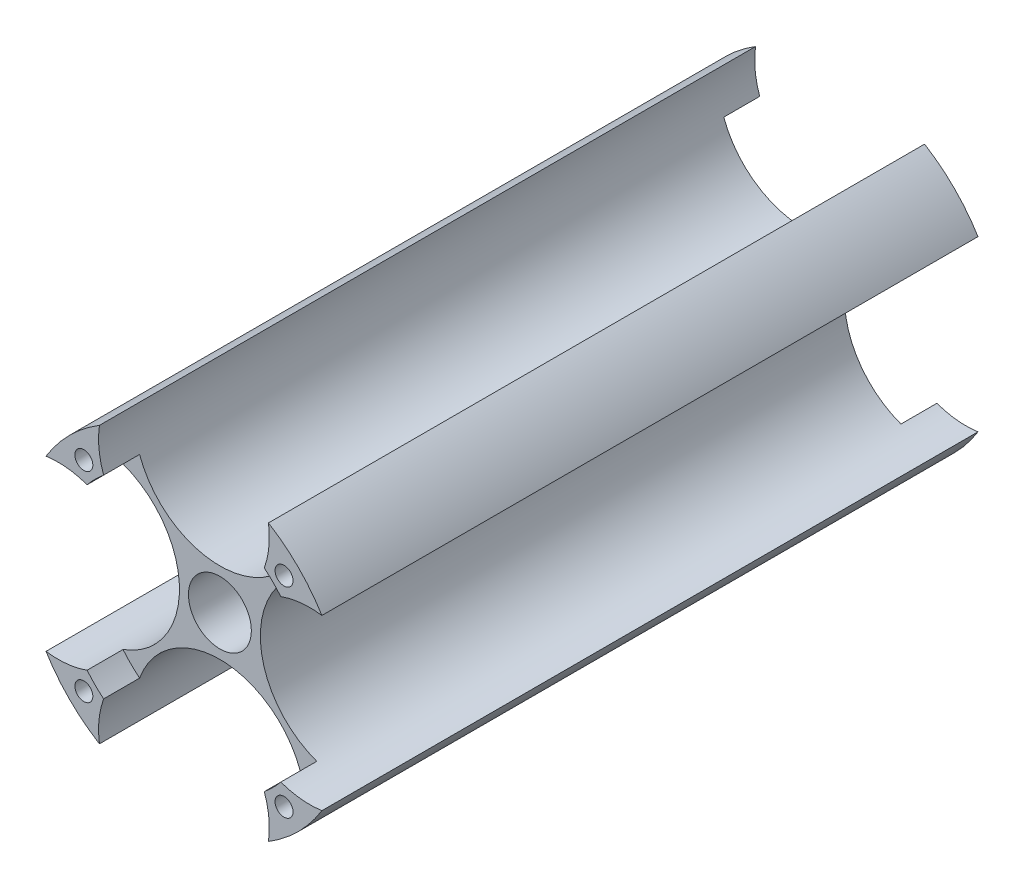
ISO-10303-21;
HEADER;
FILE_DESCRIPTION(('STEP AP214'),'2;1');
FILE_NAME('part.step','',(''),(''),'','','');
FILE_SCHEMA(('AUTOMOTIVE_DESIGN { 1 0 10303 214 1 1 1 1 }'));
ENDSEC;
DATA;
#1=APPLICATION_CONTEXT('core data for automotive mechanical design processes');
#2=APPLICATION_PROTOCOL_DEFINITION('international standard','automotive_design',2000,#1);
#3=PRODUCT_CONTEXT('',#1,'mechanical');
#4=PRODUCT('Part','Part','',(#3));
#5=PRODUCT_RELATED_PRODUCT_CATEGORY('part','',(#4));
#6=PRODUCT_DEFINITION_FORMATION('','',#4);
#7=PRODUCT_DEFINITION_CONTEXT('part definition',#1,'design');
#8=PRODUCT_DEFINITION('design','',#6,#7);
#9=PRODUCT_DEFINITION_SHAPE('','',#8);
#10=(LENGTH_UNIT() NAMED_UNIT(*) SI_UNIT(.MILLI.,.METRE.));
#11=(NAMED_UNIT(*) PLANE_ANGLE_UNIT() SI_UNIT($,.RADIAN.));
#12=(NAMED_UNIT(*) SI_UNIT($,.STERADIAN.) SOLID_ANGLE_UNIT());
#13=UNCERTAINTY_MEASURE_WITH_UNIT(LENGTH_MEASURE(1.E-05),#10,'distance_accuracy_value','');
#14=(GEOMETRIC_REPRESENTATION_CONTEXT(3) GLOBAL_UNCERTAINTY_ASSIGNED_CONTEXT((#13)) GLOBAL_UNIT_ASSIGNED_CONTEXT((#10,
#11,#12)) REPRESENTATION_CONTEXT('',''));
#15=CARTESIAN_POINT('',(0.,0.,0.));
#16=DIRECTION('',(0.,0.,1.));
#17=DIRECTION('',(1.,0.,0.));
#18=AXIS2_PLACEMENT_3D('',#15,#16,#17);
#19=CARTESIAN_POINT('',(0.,0.,0.));
#20=DIRECTION('',(0.,0.,1.));
#21=DIRECTION('',(1.,0.,0.));
#22=AXIS2_PLACEMENT_3D('',#19,#20,#21);
#23=PLANE('',#22);
#24=CARTESIAN_POINT('',(0.,0.,0.));
#25=DIRECTION('',(0.,0.,1.));
#26=DIRECTION('',(1.,0.,0.));
#27=AXIS2_PLACEMENT_3D('',#24,#25,#26);
#28=CIRCLE('',#27,3.5);
#29=CARTESIAN_POINT('',(3.5,0.,0.));
#30=VERTEX_POINT('',#29);
#31=EDGE_CURVE('E385',#30,#30,#28,.T.);
#32=ORIENTED_EDGE('',*,*,#31,.T.);
#33=EDGE_LOOP('',(#32));
#34=FACE_BOUND('',#33,.T.);
#35=CARTESIAN_POINT('',(-14.,0.,0.));
#36=DIRECTION('',(0.,0.,1.));
#37=DIRECTION('',(1.,0.,0.));
#38=AXIS2_PLACEMENT_3D('',#35,#36,#37);
#39=CIRCLE('',#38,9.5);
#40=CARTESIAN_POINT('',(-10.7767857142857,-8.93649202250903,0.));
#41=VERTEX_POINT('',#40);
#42=CARTESIAN_POINT('',(-10.7767857142857,8.93649202250902,0.));
#43=VERTEX_POINT('',#42);
#44=EDGE_CURVE('E57',#41,#43,#39,.T.);
#45=ORIENTED_EDGE('',*,*,#44,.T.);
#46=CARTESIAN_POINT('',(0.,0.,0.));
#47=DIRECTION('',(0.,0.,-1.));
#48=DIRECTION('',(-1.,0.,0.));
#49=AXIS2_PLACEMENT_3D('',#46,#47,#48);
#50=CIRCLE('',#49,14.);
#51=CARTESIAN_POINT('',(-8.93649202250903,10.7767857142857,0.));
#52=VERTEX_POINT('',#51);
#53=EDGE_CURVE('E52',#43,#52,#50,.T.);
#54=ORIENTED_EDGE('',*,*,#53,.T.);
#55=CARTESIAN_POINT('',(0.,14.,0.));
#56=DIRECTION('',(0.,0.,1.));
#57=DIRECTION('',(1.,0.,0.));
#58=AXIS2_PLACEMENT_3D('',#55,#56,#57);
#59=CIRCLE('',#58,9.50000000000001);
#60=CARTESIAN_POINT('',(8.93649202250903,10.7767857142857,0.));
#61=VERTEX_POINT('',#60);
#62=EDGE_CURVE('E398',#52,#61,#59,.T.);
#63=ORIENTED_EDGE('',*,*,#62,.T.);
#64=CARTESIAN_POINT('',(0.,0.,0.));
#65=DIRECTION('',(0.,0.,-1.));
#66=DIRECTION('',(-1.,0.,0.));
#67=AXIS2_PLACEMENT_3D('',#64,#65,#66);
#68=CIRCLE('',#67,14.);
#69=CARTESIAN_POINT('',(10.7767857142857,8.93649202250902,0.));
#70=VERTEX_POINT('',#69);
#71=EDGE_CURVE('E271',#61,#70,#68,.T.);
#72=ORIENTED_EDGE('',*,*,#71,.T.);
#73=CARTESIAN_POINT('',(14.,0.,0.));
#74=DIRECTION('',(0.,0.,1.));
#75=DIRECTION('',(1.,0.,0.));
#76=AXIS2_PLACEMENT_3D('',#73,#74,#75);
#77=CIRCLE('',#76,9.5);
#78=CARTESIAN_POINT('',(10.7767857142857,-8.93649202250902,0.));
#79=VERTEX_POINT('',#78);
#80=EDGE_CURVE('E381',#70,#79,#77,.T.);
#81=ORIENTED_EDGE('',*,*,#80,.T.);
#82=CARTESIAN_POINT('',(0.,0.,0.));
#83=DIRECTION('',(0.,0.,-1.));
#84=DIRECTION('',(-1.,0.,0.));
#85=AXIS2_PLACEMENT_3D('',#82,#83,#84);
#86=CIRCLE('',#85,14.);
#87=CARTESIAN_POINT('',(8.93649202250902,-10.7767857142857,0.));
#88=VERTEX_POINT('',#87);
#89=EDGE_CURVE('E250',#79,#88,#86,.T.);
#90=ORIENTED_EDGE('',*,*,#89,.T.);
#91=CARTESIAN_POINT('',(0.,-14.,0.));
#92=DIRECTION('',(0.,0.,1.));
#93=DIRECTION('',(1.,0.,0.));
#94=AXIS2_PLACEMENT_3D('',#91,#92,#93);
#95=CIRCLE('',#94,9.5);
#96=CARTESIAN_POINT('',(-8.93649202250902,-10.7767857142857,0.));
#97=VERTEX_POINT('',#96);
#98=EDGE_CURVE('E401',#88,#97,#95,.T.);
#99=ORIENTED_EDGE('',*,*,#98,.T.);
#100=CARTESIAN_POINT('',(0.,0.,0.));
#101=DIRECTION('',(0.,0.,-1.));
#102=DIRECTION('',(-1.,0.,0.));
#103=AXIS2_PLACEMENT_3D('',#100,#101,#102);
#104=CIRCLE('',#103,14.);
#105=EDGE_CURVE('E202',#97,#41,#104,.T.);
#106=ORIENTED_EDGE('',*,*,#105,.T.);
#107=EDGE_LOOP('',(#45,#54,#63,#72,#81,#90,#99,#106));
#108=FACE_BOUND('',#107,.T.);
#109=ADVANCED_FACE('F37',(#34,#108),#23,.F.);
#110=CARTESIAN_POINT('',(0.,0.,65.));
#111=DIRECTION('',(0.,0.,1.));
#112=DIRECTION('',(1.,0.,0.));
#113=AXIS2_PLACEMENT_3D('',#110,#111,#112);
#114=PLANE('',#113);
#115=CARTESIAN_POINT('',(0.,0.,65.));
#116=DIRECTION('',(0.,0.,1.));
#117=DIRECTION('',(1.,0.,0.));
#118=AXIS2_PLACEMENT_3D('',#115,#116,#117);
#119=CIRCLE('',#118,14.);
#120=CARTESIAN_POINT('',(-8.93649202250903,10.7767857142857,65.));
#121=VERTEX_POINT('',#120);
#122=CARTESIAN_POINT('',(-10.7767857142857,8.93649202250902,65.));
#123=VERTEX_POINT('',#122);
#124=EDGE_CURVE('E293',#121,#123,#119,.T.);
#125=ORIENTED_EDGE('',*,*,#124,.T.);
#126=CARTESIAN_POINT('',(-14.,0.,65.));
#127=DIRECTION('',(0.,0.,1.));
#128=DIRECTION('',(1.,0.,0.));
#129=AXIS2_PLACEMENT_3D('',#126,#127,#128);
#130=CIRCLE('',#129,9.5);
#131=CARTESIAN_POINT('',(-10.7767857142857,-8.93649202250902,65.));
#132=VERTEX_POINT('',#131);
#133=EDGE_CURVE('E387',#132,#123,#130,.T.);
#134=ORIENTED_EDGE('',*,*,#133,.F.);
#135=CARTESIAN_POINT('',(0.,0.,65.));
#136=DIRECTION('',(0.,0.,1.));
#137=DIRECTION('',(1.,0.,0.));
#138=AXIS2_PLACEMENT_3D('',#135,#136,#137);
#139=CIRCLE('',#138,14.);
#140=CARTESIAN_POINT('',(-8.93649202250902,-10.7767857142857,65.));
#141=VERTEX_POINT('',#140);
#142=EDGE_CURVE('E359',#132,#141,#139,.T.);
#143=ORIENTED_EDGE('',*,*,#142,.T.);
#144=CARTESIAN_POINT('',(0.,-14.,65.));
#145=DIRECTION('',(0.,0.,1.));
#146=DIRECTION('',(1.,0.,0.));
#147=AXIS2_PLACEMENT_3D('',#144,#145,#146);
#148=CIRCLE('',#147,9.5);
#149=CARTESIAN_POINT('',(8.93649202250902,-10.7767857142857,65.));
#150=VERTEX_POINT('',#149);
#151=EDGE_CURVE('E390',#150,#141,#148,.T.);
#152=ORIENTED_EDGE('',*,*,#151,.F.);
#153=CARTESIAN_POINT('',(0.,0.,65.));
#154=DIRECTION('',(0.,0.,1.));
#155=DIRECTION('',(1.,0.,0.));
#156=AXIS2_PLACEMENT_3D('',#153,#154,#155);
#157=CIRCLE('',#156,14.);
#158=CARTESIAN_POINT('',(10.7767857142857,-8.93649202250902,65.));
#159=VERTEX_POINT('',#158);
#160=EDGE_CURVE('E336',#150,#159,#157,.T.);
#161=ORIENTED_EDGE('',*,*,#160,.T.);
#162=CARTESIAN_POINT('',(14.,0.,65.));
#163=DIRECTION('',(0.,0.,1.));
#164=DIRECTION('',(1.,0.,0.));
#165=AXIS2_PLACEMENT_3D('',#162,#163,#164);
#166=CIRCLE('',#165,9.5);
#167=CARTESIAN_POINT('',(10.7767857142857,8.93649202250902,65.));
#168=VERTEX_POINT('',#167);
#169=EDGE_CURVE('E382',#168,#159,#166,.T.);
#170=ORIENTED_EDGE('',*,*,#169,.F.);
#171=CARTESIAN_POINT('',(0.,0.,65.));
#172=DIRECTION('',(0.,0.,1.));
#173=DIRECTION('',(1.,0.,0.));
#174=AXIS2_PLACEMENT_3D('',#171,#172,#173);
#175=CIRCLE('',#174,14.);
#176=CARTESIAN_POINT('',(8.93649202250903,10.7767857142857,65.));
#177=VERTEX_POINT('',#176);
#178=EDGE_CURVE('E314',#168,#177,#175,.T.);
#179=ORIENTED_EDGE('',*,*,#178,.T.);
#180=CARTESIAN_POINT('',(0.,14.,65.));
#181=DIRECTION('',(0.,0.,1.));
#182=DIRECTION('',(1.,0.,0.));
#183=AXIS2_PLACEMENT_3D('',#180,#181,#182);
#184=CIRCLE('',#183,9.50000000000001);
#185=EDGE_CURVE('E384',#121,#177,#184,.T.);
#186=ORIENTED_EDGE('',*,*,#185,.F.);
#187=EDGE_LOOP('',(#125,#134,#143,#152,#161,#170,#179,#186));
#188=FACE_BOUND('',#187,.T.);
#189=CARTESIAN_POINT('',(0.,0.,65.));
#190=DIRECTION('',(0.,0.,1.));
#191=DIRECTION('',(1.,0.,0.));
#192=AXIS2_PLACEMENT_3D('',#189,#190,#191);
#193=CIRCLE('',#192,3.5);
#194=CARTESIAN_POINT('',(3.5,0.,65.));
#195=VERTEX_POINT('',#194);
#196=EDGE_CURVE('E392',#195,#195,#193,.T.);
#197=ORIENTED_EDGE('',*,*,#196,.F.);
#198=EDGE_LOOP('',(#197));
#199=FACE_BOUND('',#198,.T.);
#200=ADVANCED_FACE('F445',(#188,#199),#114,.T.);
#201=CARTESIAN_POINT('',(14.,0.,65.));
#202=DIRECTION('',(0.,0.,-1.));
#203=DIRECTION('',(-1.,0.,0.));
#204=AXIS2_PLACEMENT_3D('',#201,#202,#203);
#205=CYLINDRICAL_SURFACE('',#204,9.5);
#206=ORIENTED_EDGE('',*,*,#80,.F.);
#207=DIRECTION('',(0.,0.,1.));
#208=VECTOR('',#207,1.);
#209=CARTESIAN_POINT('',(10.7767857142857,8.93649202250902,-4.));
#210=LINE('',#209,#208);
#211=CARTESIAN_POINT('',(10.7767857142857,8.93649202250902,-4.));
#212=VERTEX_POINT('',#211);
#213=EDGE_CURVE('E286',#212,#70,#210,.T.);
#214=ORIENTED_EDGE('',*,*,#213,.F.);
#215=CARTESIAN_POINT('',(14.,0.,-4.));
#216=DIRECTION('',(0.,0.,-1.));
#217=DIRECTION('',(-1.,0.,0.));
#218=AXIS2_PLACEMENT_3D('',#215,#216,#217);
#219=CIRCLE('',#218,9.5);
#220=CARTESIAN_POINT('',(15.3482142857143,9.40384592811878,-4.));
#221=VERTEX_POINT('',#220);
#222=EDGE_CURVE('E281',#221,#212,#219,.F.);
#223=ORIENTED_EDGE('',*,*,#222,.F.);
#224=DIRECTION('',(0.,0.,-1.));
#225=VECTOR('',#224,1.);
#226=CARTESIAN_POINT('',(15.3482142857143,9.40384592811877,65.));
#227=LINE('',#226,#225);
#228=CARTESIAN_POINT('',(15.3482142857143,9.40384592811877,69.));
#229=VERTEX_POINT('',#228);
#230=EDGE_CURVE('E11',#229,#221,#227,.T.);
#231=ORIENTED_EDGE('',*,*,#230,.F.);
#232=CARTESIAN_POINT('',(14.,0.,69.));
#233=DIRECTION('',(0.,0.,1.));
#234=DIRECTION('',(1.,0.,0.));
#235=AXIS2_PLACEMENT_3D('',#232,#233,#234);
#236=CIRCLE('',#235,9.5);
#237=CARTESIAN_POINT('',(10.7767857142857,8.93649202250902,69.));
#238=VERTEX_POINT('',#237);
#239=EDGE_CURVE('E318',#238,#229,#236,.F.);
#240=ORIENTED_EDGE('',*,*,#239,.F.);
#241=DIRECTION('',(0.,0.,-1.));
#242=VECTOR('',#241,1.);
#243=CARTESIAN_POINT('',(10.7767857142857,8.93649202250902,69.));
#244=LINE('',#243,#242);
#245=EDGE_CURVE('E334',#238,#168,#244,.T.);
#246=ORIENTED_EDGE('',*,*,#245,.T.);
#247=ORIENTED_EDGE('',*,*,#169,.T.);
#248=DIRECTION('',(0.,0.,-1.));
#249=VECTOR('',#248,1.);
#250=CARTESIAN_POINT('',(10.7767857142857,-8.93649202250902,69.));
#251=LINE('',#250,#249);
#252=CARTESIAN_POINT('',(10.7767857142857,-8.93649202250902,69.));
#253=VERTEX_POINT('',#252);
#254=EDGE_CURVE('E351',#253,#159,#251,.T.);
#255=ORIENTED_EDGE('',*,*,#254,.F.);
#256=CARTESIAN_POINT('',(14.,0.,69.));
#257=DIRECTION('',(0.,0.,1.));
#258=DIRECTION('',(1.,0.,0.));
#259=AXIS2_PLACEMENT_3D('',#256,#257,#258);
#260=CIRCLE('',#259,9.5);
#261=CARTESIAN_POINT('',(15.3482142857143,-9.40384592811876,69.));
#262=VERTEX_POINT('',#261);
#263=EDGE_CURVE('E346',#262,#253,#260,.F.);
#264=ORIENTED_EDGE('',*,*,#263,.F.);
#265=DIRECTION('',(0.,0.,-1.));
#266=VECTOR('',#265,1.);
#267=CARTESIAN_POINT('',(15.3482142857143,-9.40384592811876,65.));
#268=LINE('',#267,#266);
#269=CARTESIAN_POINT('',(15.3482142857143,-9.40384592811876,-4.));
#270=VERTEX_POINT('',#269);
#271=EDGE_CURVE('E395',#262,#270,#268,.T.);
#272=ORIENTED_EDGE('',*,*,#271,.T.);
#273=CARTESIAN_POINT('',(14.,0.,-4.));
#274=DIRECTION('',(0.,0.,-1.));
#275=DIRECTION('',(-1.,0.,0.));
#276=AXIS2_PLACEMENT_3D('',#273,#274,#275);
#277=CIRCLE('',#276,9.5);
#278=CARTESIAN_POINT('',(10.7767857142857,-8.93649202250902,-4.));
#279=VERTEX_POINT('',#278);
#280=EDGE_CURVE('E254',#279,#270,#277,.F.);
#281=ORIENTED_EDGE('',*,*,#280,.F.);
#282=DIRECTION('',(0.,0.,1.));
#283=VECTOR('',#282,1.);
#284=CARTESIAN_POINT('',(10.7767857142857,-8.93649202250902,-4.));
#285=LINE('',#284,#283);
#286=EDGE_CURVE('E269',#279,#79,#285,.T.);
#287=ORIENTED_EDGE('',*,*,#286,.T.);
#288=EDGE_LOOP('',(#206,#214,#223,#231,#240,#246,#247,#255,#264,#272,#281,#287));
#289=FACE_BOUND('',#288,.T.);
#290=ADVANCED_FACE('F431',(#289),#205,.F.);
#291=CARTESIAN_POINT('',(0.,0.,65.));
#292=DIRECTION('',(0.,0.,-1.));
#293=DIRECTION('',(-1.,0.,0.));
#294=AXIS2_PLACEMENT_3D('',#291,#292,#293);
#295=CYLINDRICAL_SURFACE('',#294,18.);
#296=ORIENTED_EDGE('',*,*,#230,.T.);
#297=CARTESIAN_POINT('',(0.,0.,-4.));
#298=DIRECTION('',(0.,0.,-1.));
#299=DIRECTION('',(-1.,0.,0.));
#300=AXIS2_PLACEMENT_3D('',#297,#298,#299);
#301=CIRCLE('',#300,18.);
#302=CARTESIAN_POINT('',(9.40384592811877,15.3482142857143,-4.));
#303=VERTEX_POINT('',#302);
#304=EDGE_CURVE('E278',#303,#221,#301,.T.);
#305=ORIENTED_EDGE('',*,*,#304,.F.);
#306=DIRECTION('',(0.,0.,-1.));
#307=VECTOR('',#306,1.);
#308=CARTESIAN_POINT('',(9.40384592811878,15.3482142857143,65.));
#309=LINE('',#308,#307);
#310=CARTESIAN_POINT('',(9.40384592811878,15.3482142857143,69.));
#311=VERTEX_POINT('',#310);
#312=EDGE_CURVE('E45',#311,#303,#309,.T.);
#313=ORIENTED_EDGE('',*,*,#312,.F.);
#314=CARTESIAN_POINT('',(0.,0.,69.));
#315=DIRECTION('',(0.,0.,1.));
#316=DIRECTION('',(1.,0.,0.));
#317=AXIS2_PLACEMENT_3D('',#314,#315,#316);
#318=CIRCLE('',#317,18.);
#319=EDGE_CURVE('E321',#229,#311,#318,.T.);
#320=ORIENTED_EDGE('',*,*,#319,.F.);
#321=EDGE_LOOP('',(#296,#305,#313,#320));
#322=FACE_BOUND('',#321,.T.);
#323=ADVANCED_FACE('F427',(#322),#295,.T.);
#324=CARTESIAN_POINT('',(0.,14.,65.));
#325=DIRECTION('',(0.,0.,-1.));
#326=DIRECTION('',(-1.,0.,0.));
#327=AXIS2_PLACEMENT_3D('',#324,#325,#326);
#328=CYLINDRICAL_SURFACE('',#327,9.50000000000001);
#329=ORIENTED_EDGE('',*,*,#62,.F.);
#330=DIRECTION('',(0.,0.,1.));
#331=VECTOR('',#330,1.);
#332=CARTESIAN_POINT('',(-8.93649202250903,10.7767857142857,-4.));
#333=LINE('',#332,#331);
#334=CARTESIAN_POINT('',(-8.93649202250903,10.7767857142857,-4.));
#335=VERTEX_POINT('',#334);
#336=EDGE_CURVE('E203',#335,#52,#333,.T.);
#337=ORIENTED_EDGE('',*,*,#336,.F.);
#338=CARTESIAN_POINT('',(0.,14.,-4.));
#339=DIRECTION('',(0.,0.,-1.));
#340=DIRECTION('',(-1.,0.,0.));
#341=AXIS2_PLACEMENT_3D('',#338,#339,#340);
#342=CIRCLE('',#341,9.50000000000001);
#343=CARTESIAN_POINT('',(-9.40384592811878,15.3482142857143,-4.));
#344=VERTEX_POINT('',#343);
#345=EDGE_CURVE('E218',#344,#335,#342,.F.);
#346=ORIENTED_EDGE('',*,*,#345,.F.);
#347=DIRECTION('',(0.,0.,-1.));
#348=VECTOR('',#347,1.);
#349=CARTESIAN_POINT('',(-9.40384592811879,15.3482142857143,65.));
#350=LINE('',#349,#348);
#351=CARTESIAN_POINT('',(-9.40384592811879,15.3482142857143,69.));
#352=VERTEX_POINT('',#351);
#353=EDGE_CURVE('E413',#352,#344,#350,.T.);
#354=ORIENTED_EDGE('',*,*,#353,.F.);
#355=CARTESIAN_POINT('',(0.,14.,69.));
#356=DIRECTION('',(0.,0.,1.));
#357=DIRECTION('',(1.,0.,0.));
#358=AXIS2_PLACEMENT_3D('',#355,#356,#357);
#359=CIRCLE('',#358,9.50000000000001);
#360=CARTESIAN_POINT('',(-8.93649202250903,10.7767857142857,69.));
#361=VERTEX_POINT('',#360);
#362=EDGE_CURVE('E297',#361,#352,#359,.F.);
#363=ORIENTED_EDGE('',*,*,#362,.F.);
#364=DIRECTION('',(0.,0.,-1.));
#365=VECTOR('',#364,1.);
#366=CARTESIAN_POINT('',(-8.93649202250903,10.7767857142857,69.));
#367=LINE('',#366,#365);
#368=EDGE_CURVE('E312',#361,#121,#367,.T.);
#369=ORIENTED_EDGE('',*,*,#368,.T.);
#370=ORIENTED_EDGE('',*,*,#185,.T.);
#371=DIRECTION('',(0.,0.,-1.));
#372=VECTOR('',#371,1.);
#373=CARTESIAN_POINT('',(8.93649202250903,10.7767857142857,69.));
#374=LINE('',#373,#372);
#375=CARTESIAN_POINT('',(8.93649202250903,10.7767857142857,69.));
#376=VERTEX_POINT('',#375);
#377=EDGE_CURVE('E329',#376,#177,#374,.T.);
#378=ORIENTED_EDGE('',*,*,#377,.F.);
#379=CARTESIAN_POINT('',(0.,14.,69.));
#380=DIRECTION('',(0.,0.,1.));
#381=DIRECTION('',(1.,0.,0.));
#382=AXIS2_PLACEMENT_3D('',#379,#380,#381);
#383=CIRCLE('',#382,9.50000000000001);
#384=EDGE_CURVE('E324',#311,#376,#383,.F.);
#385=ORIENTED_EDGE('',*,*,#384,.F.);
#386=ORIENTED_EDGE('',*,*,#312,.T.);
#387=CARTESIAN_POINT('',(0.,14.,-4.));
#388=DIRECTION('',(0.,0.,-1.));
#389=DIRECTION('',(-1.,0.,0.));
#390=AXIS2_PLACEMENT_3D('',#387,#388,#389);
#391=CIRCLE('',#390,9.50000000000001);
#392=CARTESIAN_POINT('',(8.93649202250903,10.7767857142857,-4.));
#393=VERTEX_POINT('',#392);
#394=EDGE_CURVE('E275',#393,#303,#391,.F.);
#395=ORIENTED_EDGE('',*,*,#394,.F.);
#396=DIRECTION('',(0.,0.,1.));
#397=VECTOR('',#396,1.);
#398=CARTESIAN_POINT('',(8.93649202250903,10.7767857142857,-4.));
#399=LINE('',#398,#397);
#400=EDGE_CURVE('E290',#393,#61,#399,.T.);
#401=ORIENTED_EDGE('',*,*,#400,.T.);
#402=EDGE_LOOP('',(#329,#337,#346,#354,#363,#369,#370,#378,#385,#386,#395,#401));
#403=FACE_BOUND('',#402,.T.);
#404=ADVANCED_FACE('F417',(#403),#328,.F.);
#405=ORIENTED_EDGE('',*,*,#353,.T.);
#406=CARTESIAN_POINT('',(0.,0.,-4.));
#407=DIRECTION('',(0.,0.,-1.));
#408=DIRECTION('',(-1.,0.,0.));
#409=AXIS2_PLACEMENT_3D('',#406,#407,#408);
#410=CIRCLE('',#409,18.);
#411=CARTESIAN_POINT('',(-15.3482142857143,9.40384592811877,-4.));
#412=VERTEX_POINT('',#411);
#413=EDGE_CURVE('E213',#412,#344,#410,.T.);
#414=ORIENTED_EDGE('',*,*,#413,.F.);
#415=DIRECTION('',(0.,0.,-1.));
#416=VECTOR('',#415,1.);
#417=CARTESIAN_POINT('',(-15.3482142857143,9.40384592811877,65.));
#418=LINE('',#417,#416);
#419=CARTESIAN_POINT('',(-15.3482142857143,9.40384592811877,69.));
#420=VERTEX_POINT('',#419);
#421=EDGE_CURVE('E209',#420,#412,#418,.T.);
#422=ORIENTED_EDGE('',*,*,#421,.F.);
#423=CARTESIAN_POINT('',(0.,0.,69.));
#424=DIRECTION('',(0.,0.,1.));
#425=DIRECTION('',(1.,0.,0.));
#426=AXIS2_PLACEMENT_3D('',#423,#424,#425);
#427=CIRCLE('',#426,18.);
#428=EDGE_CURVE('E300',#352,#420,#427,.T.);
#429=ORIENTED_EDGE('',*,*,#428,.F.);
#430=EDGE_LOOP('',(#405,#414,#422,#429));
#431=FACE_BOUND('',#430,.T.);
#432=ADVANCED_FACE('F481',(#431),#295,.T.);
#433=CARTESIAN_POINT('',(-14.,0.,65.));
#434=DIRECTION('',(0.,0.,-1.));
#435=DIRECTION('',(-1.,0.,0.));
#436=AXIS2_PLACEMENT_3D('',#433,#434,#435);
#437=CYLINDRICAL_SURFACE('',#436,9.5);
#438=ORIENTED_EDGE('',*,*,#44,.F.);
#439=DIRECTION('',(0.,0.,1.));
#440=VECTOR('',#439,1.);
#441=CARTESIAN_POINT('',(-10.7767857142857,-8.93649202250902,-4.));
#442=LINE('',#441,#440);
#443=CARTESIAN_POINT('',(-10.7767857142857,-8.93649202250902,-4.));
#444=VERTEX_POINT('',#443);
#445=EDGE_CURVE('E243',#444,#41,#442,.T.);
#446=ORIENTED_EDGE('',*,*,#445,.F.);
#447=CARTESIAN_POINT('',(-14.,0.,-4.));
#448=DIRECTION('',(0.,0.,-1.));
#449=DIRECTION('',(-1.,0.,0.));
#450=AXIS2_PLACEMENT_3D('',#447,#448,#449);
#451=CIRCLE('',#450,9.5);
#452=CARTESIAN_POINT('',(-15.3482142857143,-9.40384592811877,-4.));
#453=VERTEX_POINT('',#452);
#454=EDGE_CURVE('E238',#453,#444,#451,.F.);
#455=ORIENTED_EDGE('',*,*,#454,.F.);
#456=DIRECTION('',(0.,0.,-1.));
#457=VECTOR('',#456,1.);
#458=CARTESIAN_POINT('',(-15.3482142857143,-9.40384592811878,65.));
#459=LINE('',#458,#457);
#460=CARTESIAN_POINT('',(-15.3482142857143,-9.40384592811877,69.));
#461=VERTEX_POINT('',#460);
#462=EDGE_CURVE('E410',#461,#453,#459,.T.);
#463=ORIENTED_EDGE('',*,*,#462,.F.);
#464=CARTESIAN_POINT('',(-14.,0.,69.));
#465=DIRECTION('',(0.,0.,1.));
#466=DIRECTION('',(1.,0.,0.));
#467=AXIS2_PLACEMENT_3D('',#464,#465,#466);
#468=CIRCLE('',#467,9.5);
#469=CARTESIAN_POINT('',(-10.7767857142857,-8.93649202250902,69.));
#470=VERTEX_POINT('',#469);
#471=EDGE_CURVE('E363',#470,#461,#468,.F.);
#472=ORIENTED_EDGE('',*,*,#471,.F.);
#473=DIRECTION('',(0.,0.,-1.));
#474=VECTOR('',#473,1.);
#475=CARTESIAN_POINT('',(-10.7767857142857,-8.93649202250902,69.));
#476=LINE('',#475,#474);
#477=EDGE_CURVE('E379',#470,#132,#476,.T.);
#478=ORIENTED_EDGE('',*,*,#477,.T.);
#479=ORIENTED_EDGE('',*,*,#133,.T.);
#480=DIRECTION('',(0.,0.,-1.));
#481=VECTOR('',#480,1.);
#482=CARTESIAN_POINT('',(-10.7767857142857,8.93649202250902,69.));
#483=LINE('',#482,#481);
#484=CARTESIAN_POINT('',(-10.7767857142857,8.93649202250902,69.));
#485=VERTEX_POINT('',#484);
#486=EDGE_CURVE('E308',#485,#123,#483,.T.);
#487=ORIENTED_EDGE('',*,*,#486,.F.);
#488=CARTESIAN_POINT('',(-14.,0.,69.));
#489=DIRECTION('',(0.,0.,1.));
#490=DIRECTION('',(1.,0.,0.));
#491=AXIS2_PLACEMENT_3D('',#488,#489,#490);
#492=CIRCLE('',#491,9.5);
#493=EDGE_CURVE('E303',#420,#485,#492,.F.);
#494=ORIENTED_EDGE('',*,*,#493,.F.);
#495=ORIENTED_EDGE('',*,*,#421,.T.);
#496=CARTESIAN_POINT('',(-14.,0.,-4.));
#497=DIRECTION('',(0.,0.,-1.));
#498=DIRECTION('',(-1.,0.,0.));
#499=AXIS2_PLACEMENT_3D('',#496,#497,#498);
#500=CIRCLE('',#499,9.5);
#501=CARTESIAN_POINT('',(-10.7767857142857,8.93649202250902,-4.));
#502=VERTEX_POINT('',#501);
#503=EDGE_CURVE('E206',#502,#412,#500,.F.);
#504=ORIENTED_EDGE('',*,*,#503,.F.);
#505=DIRECTION('',(0.,0.,1.));
#506=VECTOR('',#505,1.);
#507=CARTESIAN_POINT('',(-10.7767857142857,8.93649202250902,-4.));
#508=LINE('',#507,#506);
#509=EDGE_CURVE('E195',#502,#43,#508,.T.);
#510=ORIENTED_EDGE('',*,*,#509,.T.);
#511=EDGE_LOOP('',(#438,#446,#455,#463,#472,#478,#479,#487,#494,#495,#504,#510));
#512=FACE_BOUND('',#511,.T.);
#513=ADVANCED_FACE('F207',(#512),#437,.F.);
#514=ORIENTED_EDGE('',*,*,#462,.T.);
#515=CARTESIAN_POINT('',(0.,0.,-4.));
#516=DIRECTION('',(0.,0.,-1.));
#517=DIRECTION('',(-1.,0.,0.));
#518=AXIS2_PLACEMENT_3D('',#515,#516,#517);
#519=CIRCLE('',#518,18.);
#520=CARTESIAN_POINT('',(-9.40384592811877,-15.3482142857143,-4.));
#521=VERTEX_POINT('',#520);
#522=EDGE_CURVE('E235',#521,#453,#519,.T.);
#523=ORIENTED_EDGE('',*,*,#522,.F.);
#524=DIRECTION('',(0.,0.,-1.));
#525=VECTOR('',#524,1.);
#526=CARTESIAN_POINT('',(-9.40384592811876,-15.3482142857143,65.));
#527=LINE('',#526,#525);
#528=CARTESIAN_POINT('',(-9.40384592811876,-15.3482142857143,69.));
#529=VERTEX_POINT('',#528);
#530=EDGE_CURVE('E408',#529,#521,#527,.T.);
#531=ORIENTED_EDGE('',*,*,#530,.F.);
#532=CARTESIAN_POINT('',(0.,0.,69.));
#533=DIRECTION('',(0.,0.,1.));
#534=DIRECTION('',(1.,0.,0.));
#535=AXIS2_PLACEMENT_3D('',#532,#533,#534);
#536=CIRCLE('',#535,18.);
#537=EDGE_CURVE('E366',#461,#529,#536,.T.);
#538=ORIENTED_EDGE('',*,*,#537,.F.);
#539=EDGE_LOOP('',(#514,#523,#531,#538));
#540=FACE_BOUND('',#539,.T.);
#541=ADVANCED_FACE('F484',(#540),#295,.T.);
#542=CARTESIAN_POINT('',(0.,-14.,65.));
#543=DIRECTION('',(0.,0.,-1.));
#544=DIRECTION('',(-1.,0.,0.));
#545=AXIS2_PLACEMENT_3D('',#542,#543,#544);
#546=CYLINDRICAL_SURFACE('',#545,9.5);
#547=ORIENTED_EDGE('',*,*,#98,.F.);
#548=DIRECTION('',(0.,0.,1.));
#549=VECTOR('',#548,1.);
#550=CARTESIAN_POINT('',(8.93649202250902,-10.7767857142857,-4.));
#551=LINE('',#550,#549);
#552=CARTESIAN_POINT('',(8.93649202250902,-10.7767857142857,-4.));
#553=VERTEX_POINT('',#552);
#554=EDGE_CURVE('E265',#553,#88,#551,.T.);
#555=ORIENTED_EDGE('',*,*,#554,.F.);
#556=CARTESIAN_POINT('',(0.,-14.,-4.));
#557=DIRECTION('',(0.,0.,-1.));
#558=DIRECTION('',(-1.,0.,0.));
#559=AXIS2_PLACEMENT_3D('',#556,#557,#558);
#560=CIRCLE('',#559,9.5);
#561=CARTESIAN_POINT('',(9.40384592811877,-15.3482142857143,-4.));
#562=VERTEX_POINT('',#561);
#563=EDGE_CURVE('E260',#562,#553,#560,.F.);
#564=ORIENTED_EDGE('',*,*,#563,.F.);
#565=DIRECTION('',(0.,0.,-1.));
#566=VECTOR('',#565,1.);
#567=CARTESIAN_POINT('',(9.40384592811877,-15.3482142857143,65.));
#568=LINE('',#567,#566);
#569=CARTESIAN_POINT('',(9.40384592811877,-15.3482142857143,69.));
#570=VERTEX_POINT('',#569);
#571=EDGE_CURVE('E406',#570,#562,#568,.T.);
#572=ORIENTED_EDGE('',*,*,#571,.F.);
#573=CARTESIAN_POINT('',(0.,-14.,69.));
#574=DIRECTION('',(0.,0.,1.));
#575=DIRECTION('',(1.,0.,0.));
#576=AXIS2_PLACEMENT_3D('',#573,#574,#575);
#577=CIRCLE('',#576,9.5);
#578=CARTESIAN_POINT('',(8.93649202250902,-10.7767857142857,69.));
#579=VERTEX_POINT('',#578);
#580=EDGE_CURVE('E340',#579,#570,#577,.F.);
#581=ORIENTED_EDGE('',*,*,#580,.F.);
#582=DIRECTION('',(0.,0.,-1.));
#583=VECTOR('',#582,1.);
#584=CARTESIAN_POINT('',(8.93649202250902,-10.7767857142857,69.));
#585=LINE('',#584,#583);
#586=EDGE_CURVE('E356',#579,#150,#585,.T.);
#587=ORIENTED_EDGE('',*,*,#586,.T.);
#588=ORIENTED_EDGE('',*,*,#151,.T.);
#589=DIRECTION('',(0.,0.,-1.));
#590=VECTOR('',#589,1.);
#591=CARTESIAN_POINT('',(-8.93649202250902,-10.7767857142857,69.));
#592=LINE('',#591,#590);
#593=CARTESIAN_POINT('',(-8.93649202250902,-10.7767857142857,69.));
#594=VERTEX_POINT('',#593);
#595=EDGE_CURVE('E374',#594,#141,#592,.T.);
#596=ORIENTED_EDGE('',*,*,#595,.F.);
#597=CARTESIAN_POINT('',(0.,-14.,69.));
#598=DIRECTION('',(0.,0.,1.));
#599=DIRECTION('',(1.,0.,0.));
#600=AXIS2_PLACEMENT_3D('',#597,#598,#599);
#601=CIRCLE('',#600,9.5);
#602=EDGE_CURVE('E369',#529,#594,#601,.F.);
#603=ORIENTED_EDGE('',*,*,#602,.F.);
#604=ORIENTED_EDGE('',*,*,#530,.T.);
#605=CARTESIAN_POINT('',(0.,-14.,-4.));
#606=DIRECTION('',(0.,0.,-1.));
#607=DIRECTION('',(-1.,0.,0.));
#608=AXIS2_PLACEMENT_3D('',#605,#606,#607);
#609=CIRCLE('',#608,9.5);
#610=CARTESIAN_POINT('',(-8.93649202250902,-10.7767857142857,-4.));
#611=VERTEX_POINT('',#610);
#612=EDGE_CURVE('E232',#611,#521,#609,.F.);
#613=ORIENTED_EDGE('',*,*,#612,.F.);
#614=DIRECTION('',(0.,0.,1.));
#615=VECTOR('',#614,1.);
#616=CARTESIAN_POINT('',(-8.93649202250902,-10.7767857142857,-4.));
#617=LINE('',#616,#615);
#618=EDGE_CURVE('E247',#611,#97,#617,.T.);
#619=ORIENTED_EDGE('',*,*,#618,.T.);
#620=EDGE_LOOP('',(#547,#555,#564,#572,#581,#587,#588,#596,#603,#604,#613,#619));
#621=FACE_BOUND('',#620,.T.);
#622=ADVANCED_FACE('F466',(#621),#546,.F.);
#623=ORIENTED_EDGE('',*,*,#571,.T.);
#624=CARTESIAN_POINT('',(0.,0.,-4.));
#625=DIRECTION('',(0.,0.,-1.));
#626=DIRECTION('',(-1.,0.,0.));
#627=AXIS2_PLACEMENT_3D('',#624,#625,#626);
#628=CIRCLE('',#627,18.);
#629=EDGE_CURVE('E257',#270,#562,#628,.T.);
#630=ORIENTED_EDGE('',*,*,#629,.F.);
#631=ORIENTED_EDGE('',*,*,#271,.F.);
#632=CARTESIAN_POINT('',(0.,0.,69.));
#633=DIRECTION('',(0.,0.,1.));
#634=DIRECTION('',(1.,0.,0.));
#635=AXIS2_PLACEMENT_3D('',#632,#633,#634);
#636=CIRCLE('',#635,18.);
#637=EDGE_CURVE('E343',#570,#262,#636,.T.);
#638=ORIENTED_EDGE('',*,*,#637,.F.);
#639=EDGE_LOOP('',(#623,#630,#631,#638));
#640=FACE_BOUND('',#639,.T.);
#641=ADVANCED_FACE('F463',(#640),#295,.T.);
#642=CARTESIAN_POINT('',(-11.1369318036881,11.1369318036881,65.));
#643=DIRECTION('',(0.,0.,-1.));
#644=DIRECTION('',(-1.,0.,0.));
#645=AXIS2_PLACEMENT_3D('',#642,#643,#644);
#646=CYLINDRICAL_SURFACE('',#645,1.);
#647=CARTESIAN_POINT('',(-11.1369318036881,11.1369318036881,69.));
#648=DIRECTION('',(0.,0.,1.));
#649=DIRECTION('',(1.,0.,0.));
#650=AXIS2_PLACEMENT_3D('',#647,#648,#649);
#651=CIRCLE('',#650,1.);
#652=CARTESIAN_POINT('',(-10.1369318036881,11.1369318036881,69.));
#653=VERTEX_POINT('',#652);
#654=EDGE_CURVE('E305',#653,#653,#651,.F.);
#655=ORIENTED_EDGE('',*,*,#654,.F.);
#656=EDGE_LOOP('',(#655));
#657=FACE_BOUND('',#656,.T.);
#658=CARTESIAN_POINT('',(-11.1369318036881,11.1369318036881,-4.));
#659=DIRECTION('',(0.,0.,-1.));
#660=DIRECTION('',(-1.,0.,0.));
#661=AXIS2_PLACEMENT_3D('',#658,#659,#660);
#662=CIRCLE('',#661,1.);
#663=CARTESIAN_POINT('',(-12.1369318036881,11.1369318036881,-4.));
#664=VERTEX_POINT('',#663);
#665=EDGE_CURVE('E225',#664,#664,#662,.F.);
#666=ORIENTED_EDGE('',*,*,#665,.F.);
#667=EDGE_LOOP('',(#666));
#668=FACE_BOUND('',#667,.T.);
#669=ADVANCED_FACE('F680',(#657,#668),#646,.F.);
#670=CARTESIAN_POINT('',(11.1369318036881,11.1369318036881,65.));
#671=DIRECTION('',(0.,0.,-1.));
#672=DIRECTION('',(-1.,0.,0.));
#673=AXIS2_PLACEMENT_3D('',#670,#671,#672);
#674=CYLINDRICAL_SURFACE('',#673,1.);
#675=CARTESIAN_POINT('',(11.1369318036881,11.1369318036881,69.));
#676=DIRECTION('',(0.,0.,1.));
#677=DIRECTION('',(1.,0.,0.));
#678=AXIS2_PLACEMENT_3D('',#675,#676,#677);
#679=CIRCLE('',#678,1.);
#680=CARTESIAN_POINT('',(12.1369318036881,11.1369318036881,69.));
#681=VERTEX_POINT('',#680);
#682=EDGE_CURVE('E326',#681,#681,#679,.F.);
#683=ORIENTED_EDGE('',*,*,#682,.F.);
#684=EDGE_LOOP('',(#683));
#685=FACE_BOUND('',#684,.T.);
#686=CARTESIAN_POINT('',(11.1369318036881,11.1369318036881,-4.));
#687=DIRECTION('',(0.,0.,-1.));
#688=DIRECTION('',(-1.,0.,0.));
#689=AXIS2_PLACEMENT_3D('',#686,#687,#688);
#690=CIRCLE('',#689,1.);
#691=CARTESIAN_POINT('',(10.1369318036881,11.1369318036881,-4.));
#692=VERTEX_POINT('',#691);
#693=EDGE_CURVE('E283',#692,#692,#690,.F.);
#694=ORIENTED_EDGE('',*,*,#693,.F.);
#695=EDGE_LOOP('',(#694));
#696=FACE_BOUND('',#695,.T.);
#697=ADVANCED_FACE('F522',(#685,#696),#674,.F.);
#698=CARTESIAN_POINT('',(11.1369318036881,-11.1369318036881,65.));
#699=DIRECTION('',(0.,0.,-1.));
#700=DIRECTION('',(-1.,0.,0.));
#701=AXIS2_PLACEMENT_3D('',#698,#699,#700);
#702=CYLINDRICAL_SURFACE('',#701,0.999999999999999);
#703=CARTESIAN_POINT('',(11.1369318036881,-11.1369318036881,69.));
#704=DIRECTION('',(0.,0.,1.));
#705=DIRECTION('',(1.,0.,0.));
#706=AXIS2_PLACEMENT_3D('',#703,#704,#705);
#707=CIRCLE('',#706,0.999999999999999);
#708=CARTESIAN_POINT('',(12.1369318036881,-11.1369318036881,69.));
#709=VERTEX_POINT('',#708);
#710=EDGE_CURVE('E348',#709,#709,#707,.F.);
#711=ORIENTED_EDGE('',*,*,#710,.F.);
#712=EDGE_LOOP('',(#711));
#713=FACE_BOUND('',#712,.T.);
#714=CARTESIAN_POINT('',(11.1369318036881,-11.1369318036881,-4.));
#715=DIRECTION('',(0.,0.,-1.));
#716=DIRECTION('',(-1.,0.,0.));
#717=AXIS2_PLACEMENT_3D('',#714,#715,#716);
#718=CIRCLE('',#717,0.999999999999999);
#719=CARTESIAN_POINT('',(10.1369318036881,-11.1369318036881,-4.));
#720=VERTEX_POINT('',#719);
#721=EDGE_CURVE('E262',#720,#720,#718,.F.);
#722=ORIENTED_EDGE('',*,*,#721,.F.);
#723=EDGE_LOOP('',(#722));
#724=FACE_BOUND('',#723,.T.);
#725=ADVANCED_FACE('F514',(#713,#724),#702,.F.);
#726=CARTESIAN_POINT('',(-11.1369318036881,-11.1369318036881,65.));
#727=DIRECTION('',(0.,0.,-1.));
#728=DIRECTION('',(-1.,0.,0.));
#729=AXIS2_PLACEMENT_3D('',#726,#727,#728);
#730=CYLINDRICAL_SURFACE('',#729,0.999999999999999);
#731=CARTESIAN_POINT('',(-11.1369318036881,-11.1369318036881,69.));
#732=DIRECTION('',(0.,0.,1.));
#733=DIRECTION('',(1.,0.,0.));
#734=AXIS2_PLACEMENT_3D('',#731,#732,#733);
#735=CIRCLE('',#734,0.999999999999999);
#736=CARTESIAN_POINT('',(-10.1369318036881,-11.1369318036881,69.));
#737=VERTEX_POINT('',#736);
#738=EDGE_CURVE('E371',#737,#737,#735,.F.);
#739=ORIENTED_EDGE('',*,*,#738,.F.);
#740=EDGE_LOOP('',(#739));
#741=FACE_BOUND('',#740,.T.);
#742=CARTESIAN_POINT('',(-11.1369318036881,-11.1369318036881,-4.));
#743=DIRECTION('',(0.,0.,-1.));
#744=DIRECTION('',(-1.,0.,0.));
#745=AXIS2_PLACEMENT_3D('',#742,#743,#744);
#746=CIRCLE('',#745,0.999999999999999);
#747=CARTESIAN_POINT('',(-12.1369318036881,-11.1369318036881,-4.));
#748=VERTEX_POINT('',#747);
#749=EDGE_CURVE('E240',#748,#748,#746,.F.);
#750=ORIENTED_EDGE('',*,*,#749,.F.);
#751=EDGE_LOOP('',(#750));
#752=FACE_BOUND('',#751,.T.);
#753=ADVANCED_FACE('F39',(#741,#752),#730,.F.);
#754=CARTESIAN_POINT('',(0.,0.,65.));
#755=DIRECTION('',(0.,0.,-1.));
#756=DIRECTION('',(-1.,0.,0.));
#757=AXIS2_PLACEMENT_3D('',#754,#755,#756);
#758=CYLINDRICAL_SURFACE('',#757,3.5);
#759=ORIENTED_EDGE('',*,*,#196,.T.);
#760=EDGE_LOOP('',(#759));
#761=FACE_BOUND('',#760,.T.);
#762=ORIENTED_EDGE('',*,*,#31,.F.);
#763=EDGE_LOOP('',(#762));
#764=FACE_BOUND('',#763,.T.);
#765=ADVANCED_FACE('F504',(#761,#764),#758,.F.);
#766=CARTESIAN_POINT('',(0.,0.,69.));
#767=DIRECTION('',(0.,0.,-1.));
#768=DIRECTION('',(-1.,0.,0.));
#769=AXIS2_PLACEMENT_3D('',#766,#767,#768);
#770=CYLINDRICAL_SURFACE('',#769,14.);
#771=ORIENTED_EDGE('',*,*,#142,.F.);
#772=ORIENTED_EDGE('',*,*,#477,.F.);
#773=CARTESIAN_POINT('',(0.,0.,69.));
#774=DIRECTION('',(0.,0.,1.));
#775=DIRECTION('',(1.,0.,0.));
#776=AXIS2_PLACEMENT_3D('',#773,#774,#775);
#777=CIRCLE('',#776,14.);
#778=EDGE_CURVE('E360',#470,#594,#777,.T.);
#779=ORIENTED_EDGE('',*,*,#778,.T.);
#780=ORIENTED_EDGE('',*,*,#595,.T.);
#781=EDGE_LOOP('',(#771,#772,#779,#780));
#782=FACE_BOUND('',#781,.T.);
#783=ADVANCED_FACE('F506',(#782),#770,.F.);
#784=CARTESIAN_POINT('',(0.,0.,69.));
#785=DIRECTION('',(0.,0.,1.));
#786=DIRECTION('',(1.,0.,0.));
#787=AXIS2_PLACEMENT_3D('',#784,#785,#786);
#788=PLANE('',#787);
#789=ORIENTED_EDGE('',*,*,#778,.F.);
#790=ORIENTED_EDGE('',*,*,#471,.T.);
#791=ORIENTED_EDGE('',*,*,#537,.T.);
#792=ORIENTED_EDGE('',*,*,#602,.T.);
#793=EDGE_LOOP('',(#789,#790,#791,#792));
#794=FACE_BOUND('',#793,.T.);
#795=ORIENTED_EDGE('',*,*,#738,.T.);
#796=EDGE_LOOP('',(#795));
#797=FACE_BOUND('',#796,.T.);
#798=ADVANCED_FACE('F512',(#794,#797),#788,.T.);
#799=CARTESIAN_POINT('',(0.,0.,69.));
#800=DIRECTION('',(0.,0.,-1.));
#801=DIRECTION('',(-1.,0.,0.));
#802=AXIS2_PLACEMENT_3D('',#799,#800,#801);
#803=CYLINDRICAL_SURFACE('',#802,14.);
#804=ORIENTED_EDGE('',*,*,#160,.F.);
#805=ORIENTED_EDGE('',*,*,#586,.F.);
#806=CARTESIAN_POINT('',(0.,0.,69.));
#807=DIRECTION('',(0.,0.,1.));
#808=DIRECTION('',(1.,0.,0.));
#809=AXIS2_PLACEMENT_3D('',#806,#807,#808);
#810=CIRCLE('',#809,14.);
#811=EDGE_CURVE('E337',#579,#253,#810,.T.);
#812=ORIENTED_EDGE('',*,*,#811,.T.);
#813=ORIENTED_EDGE('',*,*,#254,.T.);
#814=EDGE_LOOP('',(#804,#805,#812,#813));
#815=FACE_BOUND('',#814,.T.);
#816=ADVANCED_FACE('F448',(#815),#803,.F.);
#817=CARTESIAN_POINT('',(0.,0.,69.));
#818=DIRECTION('',(0.,0.,1.));
#819=DIRECTION('',(1.,0.,0.));
#820=AXIS2_PLACEMENT_3D('',#817,#818,#819);
#821=PLANE('',#820);
#822=ORIENTED_EDGE('',*,*,#811,.F.);
#823=ORIENTED_EDGE('',*,*,#580,.T.);
#824=ORIENTED_EDGE('',*,*,#637,.T.);
#825=ORIENTED_EDGE('',*,*,#263,.T.);
#826=EDGE_LOOP('',(#822,#823,#824,#825));
#827=FACE_BOUND('',#826,.T.);
#828=ORIENTED_EDGE('',*,*,#710,.T.);
#829=EDGE_LOOP('',(#828));
#830=FACE_BOUND('',#829,.T.);
#831=ADVANCED_FACE('F452',(#827,#830),#821,.T.);
#832=CARTESIAN_POINT('',(0.,0.,69.));
#833=DIRECTION('',(0.,0.,-1.));
#834=DIRECTION('',(-1.,0.,0.));
#835=AXIS2_PLACEMENT_3D('',#832,#833,#834);
#836=CYLINDRICAL_SURFACE('',#835,14.);
#837=ORIENTED_EDGE('',*,*,#178,.F.);
#838=ORIENTED_EDGE('',*,*,#245,.F.);
#839=CARTESIAN_POINT('',(0.,0.,69.));
#840=DIRECTION('',(0.,0.,1.));
#841=DIRECTION('',(1.,0.,0.));
#842=AXIS2_PLACEMENT_3D('',#839,#840,#841);
#843=CIRCLE('',#842,14.);
#844=EDGE_CURVE('E315',#238,#376,#843,.T.);
#845=ORIENTED_EDGE('',*,*,#844,.T.);
#846=ORIENTED_EDGE('',*,*,#377,.T.);
#847=EDGE_LOOP('',(#837,#838,#845,#846));
#848=FACE_BOUND('',#847,.T.);
#849=ADVANCED_FACE('F439',(#848),#836,.F.);
#850=CARTESIAN_POINT('',(0.,0.,69.));
#851=DIRECTION('',(0.,0.,1.));
#852=DIRECTION('',(1.,0.,0.));
#853=AXIS2_PLACEMENT_3D('',#850,#851,#852);
#854=PLANE('',#853);
#855=ORIENTED_EDGE('',*,*,#844,.F.);
#856=ORIENTED_EDGE('',*,*,#239,.T.);
#857=ORIENTED_EDGE('',*,*,#319,.T.);
#858=ORIENTED_EDGE('',*,*,#384,.T.);
#859=EDGE_LOOP('',(#855,#856,#857,#858));
#860=FACE_BOUND('',#859,.T.);
#861=ORIENTED_EDGE('',*,*,#682,.T.);
#862=EDGE_LOOP('',(#861));
#863=FACE_BOUND('',#862,.T.);
#864=ADVANCED_FACE('F435',(#860,#863),#854,.T.);
#865=CARTESIAN_POINT('',(0.,0.,69.));
#866=DIRECTION('',(0.,0.,-1.));
#867=DIRECTION('',(-1.,0.,0.));
#868=AXIS2_PLACEMENT_3D('',#865,#866,#867);
#869=CYLINDRICAL_SURFACE('',#868,14.);
#870=ORIENTED_EDGE('',*,*,#124,.F.);
#871=ORIENTED_EDGE('',*,*,#368,.F.);
#872=CARTESIAN_POINT('',(0.,0.,69.));
#873=DIRECTION('',(0.,0.,1.));
#874=DIRECTION('',(1.,0.,0.));
#875=AXIS2_PLACEMENT_3D('',#872,#873,#874);
#876=CIRCLE('',#875,14.);
#877=EDGE_CURVE('E294',#361,#485,#876,.T.);
#878=ORIENTED_EDGE('',*,*,#877,.T.);
#879=ORIENTED_EDGE('',*,*,#486,.T.);
#880=EDGE_LOOP('',(#870,#871,#878,#879));
#881=FACE_BOUND('',#880,.T.);
#882=ADVANCED_FACE('F553',(#881),#869,.F.);
#883=CARTESIAN_POINT('',(0.,0.,69.));
#884=DIRECTION('',(0.,0.,1.));
#885=DIRECTION('',(1.,0.,0.));
#886=AXIS2_PLACEMENT_3D('',#883,#884,#885);
#887=PLANE('',#886);
#888=ORIENTED_EDGE('',*,*,#877,.F.);
#889=ORIENTED_EDGE('',*,*,#362,.T.);
#890=ORIENTED_EDGE('',*,*,#428,.T.);
#891=ORIENTED_EDGE('',*,*,#493,.T.);
#892=EDGE_LOOP('',(#888,#889,#890,#891));
#893=FACE_BOUND('',#892,.T.);
#894=ORIENTED_EDGE('',*,*,#654,.T.);
#895=EDGE_LOOP('',(#894));
#896=FACE_BOUND('',#895,.T.);
#897=ADVANCED_FACE('F479',(#893,#896),#887,.T.);
#898=CARTESIAN_POINT('',(0.,0.,-4.));
#899=DIRECTION('',(0.,0.,1.));
#900=DIRECTION('',(1.,0.,0.));
#901=AXIS2_PLACEMENT_3D('',#898,#899,#900);
#902=CYLINDRICAL_SURFACE('',#901,14.);
#903=ORIENTED_EDGE('',*,*,#71,.F.);
#904=ORIENTED_EDGE('',*,*,#400,.F.);
#905=CARTESIAN_POINT('',(0.,0.,-4.));
#906=DIRECTION('',(0.,0.,-1.));
#907=DIRECTION('',(-1.,0.,0.));
#908=AXIS2_PLACEMENT_3D('',#905,#906,#907);
#909=CIRCLE('',#908,14.);
#910=EDGE_CURVE('E272',#393,#212,#909,.T.);
#911=ORIENTED_EDGE('',*,*,#910,.T.);
#912=ORIENTED_EDGE('',*,*,#213,.T.);
#913=EDGE_LOOP('',(#903,#904,#911,#912));
#914=FACE_BOUND('',#913,.T.);
#915=ADVANCED_FACE('F473',(#914),#902,.F.);
#916=CARTESIAN_POINT('',(0.,0.,-4.));
#917=DIRECTION('',(0.,0.,-1.));
#918=DIRECTION('',(-1.,0.,0.));
#919=AXIS2_PLACEMENT_3D('',#916,#917,#918);
#920=PLANE('',#919);
#921=ORIENTED_EDGE('',*,*,#910,.F.);
#922=ORIENTED_EDGE('',*,*,#394,.T.);
#923=ORIENTED_EDGE('',*,*,#304,.T.);
#924=ORIENTED_EDGE('',*,*,#222,.T.);
#925=EDGE_LOOP('',(#921,#922,#923,#924));
#926=FACE_BOUND('',#925,.T.);
#927=ORIENTED_EDGE('',*,*,#693,.T.);
#928=EDGE_LOOP('',(#927));
#929=FACE_BOUND('',#928,.T.);
#930=ADVANCED_FACE('F424',(#926,#929),#920,.T.);
#931=CARTESIAN_POINT('',(0.,0.,-4.));
#932=DIRECTION('',(0.,0.,1.));
#933=DIRECTION('',(1.,0.,0.));
#934=AXIS2_PLACEMENT_3D('',#931,#932,#933);
#935=CYLINDRICAL_SURFACE('',#934,14.);
#936=ORIENTED_EDGE('',*,*,#89,.F.);
#937=ORIENTED_EDGE('',*,*,#286,.F.);
#938=CARTESIAN_POINT('',(0.,0.,-4.));
#939=DIRECTION('',(0.,0.,-1.));
#940=DIRECTION('',(-1.,0.,0.));
#941=AXIS2_PLACEMENT_3D('',#938,#939,#940);
#942=CIRCLE('',#941,14.);
#943=EDGE_CURVE('E251',#279,#553,#942,.T.);
#944=ORIENTED_EDGE('',*,*,#943,.T.);
#945=ORIENTED_EDGE('',*,*,#554,.T.);
#946=EDGE_LOOP('',(#936,#937,#944,#945));
#947=FACE_BOUND('',#946,.T.);
#948=ADVANCED_FACE('F470',(#947),#935,.F.);
#949=CARTESIAN_POINT('',(0.,0.,-4.));
#950=DIRECTION('',(0.,0.,-1.));
#951=DIRECTION('',(-1.,0.,0.));
#952=AXIS2_PLACEMENT_3D('',#949,#950,#951);
#953=PLANE('',#952);
#954=ORIENTED_EDGE('',*,*,#943,.F.);
#955=ORIENTED_EDGE('',*,*,#280,.T.);
#956=ORIENTED_EDGE('',*,*,#629,.T.);
#957=ORIENTED_EDGE('',*,*,#563,.T.);
#958=EDGE_LOOP('',(#954,#955,#956,#957));
#959=FACE_BOUND('',#958,.T.);
#960=ORIENTED_EDGE('',*,*,#721,.T.);
#961=EDGE_LOOP('',(#960));
#962=FACE_BOUND('',#961,.T.);
#963=ADVANCED_FACE('F460',(#959,#962),#953,.T.);
#964=CARTESIAN_POINT('',(0.,0.,-4.));
#965=DIRECTION('',(0.,0.,1.));
#966=DIRECTION('',(1.,0.,0.));
#967=AXIS2_PLACEMENT_3D('',#964,#965,#966);
#968=CYLINDRICAL_SURFACE('',#967,14.);
#969=ORIENTED_EDGE('',*,*,#105,.F.);
#970=ORIENTED_EDGE('',*,*,#618,.F.);
#971=CARTESIAN_POINT('',(0.,0.,-4.));
#972=DIRECTION('',(0.,0.,-1.));
#973=DIRECTION('',(-1.,0.,0.));
#974=AXIS2_PLACEMENT_3D('',#971,#972,#973);
#975=CIRCLE('',#974,14.);
#976=EDGE_CURVE('E229',#611,#444,#975,.T.);
#977=ORIENTED_EDGE('',*,*,#976,.T.);
#978=ORIENTED_EDGE('',*,*,#445,.T.);
#979=EDGE_LOOP('',(#969,#970,#977,#978));
#980=FACE_BOUND('',#979,.T.);
#981=ADVANCED_FACE('F530',(#980),#968,.F.);
#982=CARTESIAN_POINT('',(0.,0.,-4.));
#983=DIRECTION('',(0.,0.,-1.));
#984=DIRECTION('',(-1.,0.,0.));
#985=AXIS2_PLACEMENT_3D('',#982,#983,#984);
#986=PLANE('',#985);
#987=ORIENTED_EDGE('',*,*,#976,.F.);
#988=ORIENTED_EDGE('',*,*,#612,.T.);
#989=ORIENTED_EDGE('',*,*,#522,.T.);
#990=ORIENTED_EDGE('',*,*,#454,.T.);
#991=EDGE_LOOP('',(#987,#988,#989,#990));
#992=FACE_BOUND('',#991,.T.);
#993=ORIENTED_EDGE('',*,*,#749,.T.);
#994=EDGE_LOOP('',(#993));
#995=FACE_BOUND('',#994,.T.);
#996=ADVANCED_FACE('F528',(#992,#995),#986,.T.);
#997=CARTESIAN_POINT('',(0.,0.,-4.));
#998=DIRECTION('',(0.,0.,1.));
#999=DIRECTION('',(1.,0.,0.));
#1000=AXIS2_PLACEMENT_3D('',#997,#998,#999);
#1001=CYLINDRICAL_SURFACE('',#1000,14.);
#1002=ORIENTED_EDGE('',*,*,#53,.F.);
#1003=ORIENTED_EDGE('',*,*,#509,.F.);
#1004=CARTESIAN_POINT('',(0.,0.,-4.));
#1005=DIRECTION('',(0.,0.,-1.));
#1006=DIRECTION('',(-1.,0.,0.));
#1007=AXIS2_PLACEMENT_3D('',#1004,#1005,#1006);
#1008=CIRCLE('',#1007,14.);
#1009=EDGE_CURVE('E200',#502,#335,#1008,.T.);
#1010=ORIENTED_EDGE('',*,*,#1009,.T.);
#1011=ORIENTED_EDGE('',*,*,#336,.T.);
#1012=EDGE_LOOP('',(#1002,#1003,#1010,#1011));
#1013=FACE_BOUND('',#1012,.T.);
#1014=ADVANCED_FACE('F197',(#1013),#1001,.F.);
#1015=CARTESIAN_POINT('',(0.,0.,-4.));
#1016=DIRECTION('',(0.,0.,-1.));
#1017=DIRECTION('',(-1.,0.,0.));
#1018=AXIS2_PLACEMENT_3D('',#1015,#1016,#1017);
#1019=PLANE('',#1018);
#1020=ORIENTED_EDGE('',*,*,#1009,.F.);
#1021=ORIENTED_EDGE('',*,*,#503,.T.);
#1022=ORIENTED_EDGE('',*,*,#413,.T.);
#1023=ORIENTED_EDGE('',*,*,#345,.T.);
#1024=EDGE_LOOP('',(#1020,#1021,#1022,#1023));
#1025=FACE_BOUND('',#1024,.T.);
#1026=ORIENTED_EDGE('',*,*,#665,.T.);
#1027=EDGE_LOOP('',(#1026));
#1028=FACE_BOUND('',#1027,.T.);
#1029=ADVANCED_FACE('F215',(#1025,#1028),#1019,.T.);
#1030=CLOSED_SHELL('',(#109,#200,#290,#323,#404,#432,#513,#541,#622,#641,#669,#697,#725,#753,
#765,#783,#798,#816,#831,#849,#864,#882,#897,#915,#930,#948,#963,#981,#996,#1014,#1029));
#1031=MANIFOLD_SOLID_BREP('B2',#1030);
#1032=ADVANCED_BREP_SHAPE_REPRESENTATION('',(#18,#1031),#14);
#1033=SHAPE_DEFINITION_REPRESENTATION(#9,#1032);
ENDSEC;
END-ISO-10303-21;
